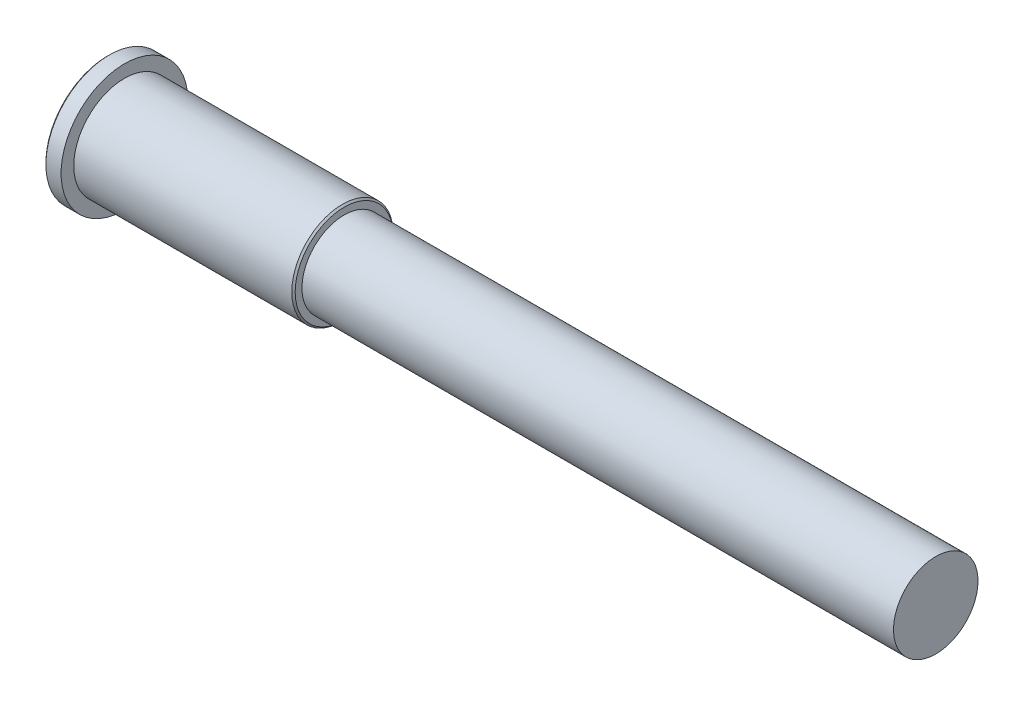
ISO-10303-21;
HEADER;
FILE_DESCRIPTION(('STEP AP214'),'2;1');
FILE_NAME('part.step','',(''),(''),'','','');
FILE_SCHEMA(('AUTOMOTIVE_DESIGN { 1 0 10303 214 1 1 1 1 }'));
ENDSEC;
DATA;
#1=APPLICATION_CONTEXT('core data for automotive mechanical design processes');
#2=APPLICATION_PROTOCOL_DEFINITION('international standard','automotive_design',2000,#1);
#3=PRODUCT_CONTEXT('',#1,'mechanical');
#4=PRODUCT('Part','Part','',(#3));
#5=PRODUCT_RELATED_PRODUCT_CATEGORY('part','',(#4));
#6=PRODUCT_DEFINITION_FORMATION('','',#4);
#7=PRODUCT_DEFINITION_CONTEXT('part definition',#1,'design');
#8=PRODUCT_DEFINITION('design','',#6,#7);
#9=PRODUCT_DEFINITION_SHAPE('','',#8);
#10=(LENGTH_UNIT() NAMED_UNIT(*) SI_UNIT(.MILLI.,.METRE.));
#11=(NAMED_UNIT(*) PLANE_ANGLE_UNIT() SI_UNIT($,.RADIAN.));
#12=(NAMED_UNIT(*) SI_UNIT($,.STERADIAN.) SOLID_ANGLE_UNIT());
#13=UNCERTAINTY_MEASURE_WITH_UNIT(LENGTH_MEASURE(1.E-05),#10,'distance_accuracy_value','');
#14=(GEOMETRIC_REPRESENTATION_CONTEXT(3) GLOBAL_UNCERTAINTY_ASSIGNED_CONTEXT((#13)) GLOBAL_UNIT_ASSIGNED_CONTEXT((#10,
#11,#12)) REPRESENTATION_CONTEXT('',''));
#15=CARTESIAN_POINT('',(0.,0.,0.));
#16=DIRECTION('',(0.,0.,1.));
#17=DIRECTION('',(1.,0.,0.));
#18=AXIS2_PLACEMENT_3D('',#15,#16,#17);
#19=CARTESIAN_POINT('',(2.,0.,0.));
#20=DIRECTION('',(-1.,0.,0.));
#21=DIRECTION('',(0.,0.,1.));
#22=AXIS2_PLACEMENT_3D('',#19,#20,#21);
#23=CYLINDRICAL_SURFACE('',#22,7.5);
#24=CARTESIAN_POINT('',(0.2,0.,0.));
#25=DIRECTION('',(1.,0.,0.));
#26=DIRECTION('',(0.,0.,-1.));
#27=AXIS2_PLACEMENT_3D('',#24,#25,#26);
#28=CIRCLE('',#27,7.5);
#29=CARTESIAN_POINT('',(0.2,0.,-7.5));
#30=VERTEX_POINT('',#29);
#31=EDGE_CURVE('E52',#30,#30,#28,.T.);
#32=ORIENTED_EDGE('',*,*,#31,.T.);
#33=EDGE_LOOP('',(#32));
#34=FACE_BOUND('',#33,.T.);
#35=CARTESIAN_POINT('',(2.,0.,0.));
#36=DIRECTION('',(1.,0.,0.));
#37=DIRECTION('',(0.,0.,-1.));
#38=AXIS2_PLACEMENT_3D('',#35,#36,#37);
#39=CIRCLE('',#38,7.5);
#40=CARTESIAN_POINT('',(2.,0.,-7.5));
#41=VERTEX_POINT('',#40);
#42=EDGE_CURVE('E69',#41,#41,#39,.T.);
#43=ORIENTED_EDGE('',*,*,#42,.F.);
#44=EDGE_LOOP('',(#43));
#45=FACE_BOUND('',#44,.T.);
#46=ADVANCED_FACE('F43',(#34,#45),#23,.T.);
#47=CARTESIAN_POINT('',(2.,0.,0.));
#48=DIRECTION('',(1.,0.,0.));
#49=DIRECTION('',(0.,0.,-1.));
#50=AXIS2_PLACEMENT_3D('',#47,#48,#49);
#51=PLANE('',#50);
#52=CARTESIAN_POINT('',(2.,0.,0.));
#53=DIRECTION('',(1.,0.,0.));
#54=DIRECTION('',(0.,0.,-1.));
#55=AXIS2_PLACEMENT_3D('',#52,#53,#54);
#56=CIRCLE('',#55,6.);
#57=CARTESIAN_POINT('',(2.,0.,6.));
#58=VERTEX_POINT('',#57);
#59=EDGE_CURVE('E73',#58,#58,#56,.T.);
#60=ORIENTED_EDGE('',*,*,#59,.F.);
#61=EDGE_LOOP('',(#60));
#62=FACE_BOUND('',#61,.T.);
#63=ORIENTED_EDGE('',*,*,#42,.T.);
#64=EDGE_LOOP('',(#63));
#65=FACE_BOUND('',#64,.T.);
#66=ADVANCED_FACE('F105',(#62,#65),#51,.T.);
#67=CARTESIAN_POINT('',(0.,0.,0.));
#68=DIRECTION('',(1.,0.,0.));
#69=DIRECTION('',(0.,0.,-1.));
#70=AXIS2_PLACEMENT_3D('',#67,#68,#69);
#71=PLANE('',#70);
#72=CARTESIAN_POINT('',(0.,0.,0.));
#73=DIRECTION('',(1.,0.,0.));
#74=DIRECTION('',(0.,0.,-1.));
#75=AXIS2_PLACEMENT_3D('',#72,#73,#74);
#76=CIRCLE('',#75,7.3);
#77=CARTESIAN_POINT('',(0.,0.,-7.3));
#78=VERTEX_POINT('',#77);
#79=EDGE_CURVE('E10',#78,#78,#76,.F.);
#80=ORIENTED_EDGE('',*,*,#79,.T.);
#81=EDGE_LOOP('',(#80));
#82=FACE_BOUND('',#81,.T.);
#83=ADVANCED_FACE('F101',(#82),#71,.F.);
#84=CARTESIAN_POINT('',(28.,0.,0.));
#85=DIRECTION('',(-1.,0.,0.));
#86=DIRECTION('',(0.,0.,1.));
#87=AXIS2_PLACEMENT_3D('',#84,#85,#86);
#88=CYLINDRICAL_SURFACE('',#87,6.);
#89=CARTESIAN_POINT('',(27.8000000000001,0.,0.));
#90=DIRECTION('',(1.,0.,0.));
#91=DIRECTION('',(0.,0.,-1.));
#92=AXIS2_PLACEMENT_3D('',#89,#90,#91);
#93=CIRCLE('',#92,6.);
#94=CARTESIAN_POINT('',(27.8000000000001,0.,6.));
#95=VERTEX_POINT('',#94);
#96=EDGE_CURVE('E57',#95,#95,#93,.F.);
#97=CARTESIAN_POINT('',(27.8000000000001,0.,6.));
#98=CARTESIAN_POINT('',(27.5312500000001,0.,6.));
#99=CARTESIAN_POINT('',(27.2625000000001,0.,6.));
#100=CARTESIAN_POINT('',(26.7250000000001,0.,6.));
#101=CARTESIAN_POINT('',(26.4562500000001,0.,6.));
#102=CARTESIAN_POINT('',(25.9187500000001,0.,6.));
#103=CARTESIAN_POINT('',(25.6500000000001,0.,6.));
#104=CARTESIAN_POINT('',(25.1125000000001,0.,6.));
#105=CARTESIAN_POINT('',(24.8437500000001,0.,6.));
#106=CARTESIAN_POINT('',(24.3062500000001,0.,6.));
#107=CARTESIAN_POINT('',(24.0375000000001,0.,6.));
#108=CARTESIAN_POINT('',(23.5000000000001,0.,6.));
#109=CARTESIAN_POINT('',(23.2312500000001,0.,6.));
#110=CARTESIAN_POINT('',(22.6937500000001,0.,6.));
#111=CARTESIAN_POINT('',(22.4250000000001,0.,6.));
#112=CARTESIAN_POINT('',(21.8875000000001,0.,6.));
#113=CARTESIAN_POINT('',(21.6187500000001,0.,6.));
#114=CARTESIAN_POINT('',(21.0812500000001,0.,6.));
#115=CARTESIAN_POINT('',(20.8125000000001,0.,6.));
#116=CARTESIAN_POINT('',(20.275,0.,6.));
#117=CARTESIAN_POINT('',(20.0062500000001,0.,6.));
#118=CARTESIAN_POINT('',(19.46875,0.,6.));
#119=CARTESIAN_POINT('',(19.2,0.,6.));
#120=CARTESIAN_POINT('',(18.6625,0.,6.));
#121=CARTESIAN_POINT('',(18.39375,0.,6.));
#122=CARTESIAN_POINT('',(17.85625,0.,6.));
#123=CARTESIAN_POINT('',(17.5875,0.,6.));
#124=CARTESIAN_POINT('',(17.05,0.,6.));
#125=CARTESIAN_POINT('',(16.78125,0.,6.));
#126=CARTESIAN_POINT('',(16.24375,0.,6.));
#127=CARTESIAN_POINT('',(15.975,0.,6.));
#128=CARTESIAN_POINT('',(15.4375,0.,6.));
#129=CARTESIAN_POINT('',(15.16875,0.,6.));
#130=CARTESIAN_POINT('',(14.63125,0.,6.));
#131=CARTESIAN_POINT('',(14.3625,0.,6.));
#132=CARTESIAN_POINT('',(13.825,0.,6.));
#133=CARTESIAN_POINT('',(13.55625,0.,6.));
#134=CARTESIAN_POINT('',(13.01875,0.,6.));
#135=CARTESIAN_POINT('',(12.75,0.,6.));
#136=CARTESIAN_POINT('',(12.2125,0.,6.));
#137=CARTESIAN_POINT('',(11.94375,0.,6.));
#138=CARTESIAN_POINT('',(11.40625,0.,6.));
#139=CARTESIAN_POINT('',(11.1375,0.,6.));
#140=CARTESIAN_POINT('',(10.6,0.,6.));
#141=CARTESIAN_POINT('',(10.33125,0.,6.));
#142=CARTESIAN_POINT('',(9.79375000000002,0.,6.));
#143=CARTESIAN_POINT('',(9.52500000000002,0.,6.));
#144=CARTESIAN_POINT('',(8.98750000000002,0.,6.));
#145=CARTESIAN_POINT('',(8.71875000000002,0.,6.));
#146=CARTESIAN_POINT('',(8.18125000000002,0.,6.));
#147=CARTESIAN_POINT('',(7.91250000000001,0.,6.));
#148=CARTESIAN_POINT('',(7.37500000000001,0.,6.));
#149=CARTESIAN_POINT('',(7.10625000000001,0.,6.));
#150=CARTESIAN_POINT('',(6.56875000000001,0.,6.));
#151=CARTESIAN_POINT('',(6.30000000000001,0.,6.));
#152=CARTESIAN_POINT('',(5.76250000000001,0.,6.));
#153=CARTESIAN_POINT('',(5.49375000000001,0.,6.));
#154=CARTESIAN_POINT('',(4.95625000000001,0.,6.));
#155=CARTESIAN_POINT('',(4.68750000000001,0.,6.));
#156=CARTESIAN_POINT('',(4.15000000000001,0.,6.));
#157=CARTESIAN_POINT('',(3.88125,0.,6.));
#158=CARTESIAN_POINT('',(3.34375,0.,6.));
#159=CARTESIAN_POINT('',(3.075,0.,6.));
#160=CARTESIAN_POINT('',(2.5375,0.,6.));
#161=CARTESIAN_POINT('',(2.26875,0.,6.));
#162=CARTESIAN_POINT('',(2.,0.,6.));
#163=B_SPLINE_CURVE_WITH_KNOTS('',3,(#97,#98,#99,#100,#101,#102,#103,#104,#105,#106,#107,#108,
#109,#110,#111,#112,#113,#114,#115,#116,#117,#118,#119,#120,#121,#122,#123,#124,#125,#126,#127,
#128,#129,#130,#131,#132,#133,#134,#135,#136,#137,#138,#139,#140,#141,#142,#143,#144,#145,#146,
#147,#148,#149,#150,#151,#152,#153,#154,#155,#156,#157,#158,#159,#160,#161,#162),.UNSPECIFIED.,
.F.,.F.,(4,2,2,2,2,2,2,2,2,2,2,2,2,2,2,2,2,2,2,2,2,2,2,2,2,2,2,2,2,2,2,2,4),(0.,
0.806250000000001,1.6125,2.41875,3.22500000000001,4.03125000000001,4.83750000000001,
5.64375000000001,6.45000000000001,7.25625000000002,8.06250000000002,8.86875000000002,
9.67500000000003,10.48125,11.2875,12.09375,12.9,13.70625,14.5125,15.31875,16.125,16.93125,
17.7375,18.54375,19.3500000000001,20.1562500000001,20.9625000000001,21.7687500000001,
22.5750000000001,23.3812500000001,24.1875000000001,24.9937500000001,25.8000000000001),.UNSPECIFIED.);
#164=EDGE_CURVE('BSEAM95',#95,#58,#163,.T.);
#165=ORIENTED_EDGE('',*,*,#96,.T.);
#166=ORIENTED_EDGE('',*,*,#59,.T.);
#167=ORIENTED_EDGE('',*,*,#164,.T.);
#168=ORIENTED_EDGE('',*,*,#164,.F.);
#169=EDGE_LOOP('',(#165,#167,#166,#168));
#170=FACE_BOUND('',#169,.T.);
#171=ADVANCED_FACE('F95',(#170),#88,.T.);
#172=CARTESIAN_POINT('',(28.,0.,0.));
#173=DIRECTION('',(1.,0.,0.));
#174=DIRECTION('',(0.,0.,-1.));
#175=AXIS2_PLACEMENT_3D('',#172,#173,#174);
#176=PLANE('',#175);
#177=CARTESIAN_POINT('',(28.,0.,0.));
#178=DIRECTION('',(1.,0.,0.));
#179=DIRECTION('',(0.,0.,-1.));
#180=AXIS2_PLACEMENT_3D('',#177,#178,#179);
#181=CIRCLE('',#180,5.80000000000007);
#182=CARTESIAN_POINT('',(28.,0.,5.80000000000007));
#183=VERTEX_POINT('',#182);
#184=EDGE_CURVE('E62',#183,#183,#181,.T.);
#185=ORIENTED_EDGE('',*,*,#184,.T.);
#186=EDGE_LOOP('',(#185));
#187=FACE_BOUND('',#186,.T.);
#188=CARTESIAN_POINT('',(28.,0.,0.));
#189=DIRECTION('',(1.,0.,0.));
#190=DIRECTION('',(0.,0.,-1.));
#191=AXIS2_PLACEMENT_3D('',#188,#189,#190);
#192=CIRCLE('',#191,5.);
#193=CARTESIAN_POINT('',(28.,0.,-5.));
#194=VERTEX_POINT('',#193);
#195=EDGE_CURVE('E68',#194,#194,#192,.T.);
#196=ORIENTED_EDGE('',*,*,#195,.F.);
#197=EDGE_LOOP('',(#196));
#198=FACE_BOUND('',#197,.T.);
#199=ADVANCED_FACE('F90',(#187,#198),#176,.T.);
#200=CARTESIAN_POINT('',(98.,0.,0.));
#201=DIRECTION('',(-1.,0.,0.));
#202=DIRECTION('',(0.,0.,1.));
#203=AXIS2_PLACEMENT_3D('',#200,#201,#202);
#204=CYLINDRICAL_SURFACE('',#203,5.);
#205=CARTESIAN_POINT('',(98.,0.,0.));
#206=DIRECTION('',(1.,0.,0.));
#207=DIRECTION('',(0.,0.,-1.));
#208=AXIS2_PLACEMENT_3D('',#205,#206,#207);
#209=CIRCLE('',#208,5.);
#210=CARTESIAN_POINT('',(98.,0.,-5.));
#211=VERTEX_POINT('',#210);
#212=EDGE_CURVE('E74',#211,#211,#209,.T.);
#213=ORIENTED_EDGE('',*,*,#212,.F.);
#214=EDGE_LOOP('',(#213));
#215=FACE_BOUND('',#214,.T.);
#216=ORIENTED_EDGE('',*,*,#195,.T.);
#217=EDGE_LOOP('',(#216));
#218=FACE_BOUND('',#217,.T.);
#219=ADVANCED_FACE('F87',(#215,#218),#204,.T.);
#220=CARTESIAN_POINT('',(98.,0.,0.));
#221=DIRECTION('',(1.,0.,0.));
#222=DIRECTION('',(0.,0.,-1.));
#223=AXIS2_PLACEMENT_3D('',#220,#221,#222);
#224=PLANE('',#223);
#225=ORIENTED_EDGE('',*,*,#212,.T.);
#226=EDGE_LOOP('',(#225));
#227=FACE_BOUND('',#226,.T.);
#228=ADVANCED_FACE('F85',(#227),#224,.T.);
#229=CARTESIAN_POINT('',(28.,0.,0.));
#230=DIRECTION('',(-1.,0.,0.));
#231=DIRECTION('',(0.,0.,1.));
#232=AXIS2_PLACEMENT_3D('',#229,#230,#231);
#233=CONICAL_SURFACE('',#232,5.80000000000007,0.785398163397474);
#234=CARTESIAN_POINT('',(27.8000000000001,0.,6.));
#235=CARTESIAN_POINT('',(27.8020833333334,0.,5.99791666666667));
#236=CARTESIAN_POINT('',(27.8041666666667,0.,5.99583333333334));
#237=CARTESIAN_POINT('',(27.8083333333334,0.,5.99166666666667));
#238=CARTESIAN_POINT('',(27.8104166666667,0.,5.98958333333334));
#239=CARTESIAN_POINT('',(27.8145833333334,0.,5.98541666666667));
#240=CARTESIAN_POINT('',(27.8166666666667,0.,5.98333333333334));
#241=CARTESIAN_POINT('',(27.8208333333334,0.,5.97916666666668));
#242=CARTESIAN_POINT('',(27.8229166666667,0.,5.97708333333334));
#243=CARTESIAN_POINT('',(27.8270833333334,0.,5.97291666666668));
#244=CARTESIAN_POINT('',(27.8291666666667,0.,5.97083333333335));
#245=CARTESIAN_POINT('',(27.8333333333334,0.,5.96666666666668));
#246=CARTESIAN_POINT('',(27.8354166666667,0.,5.96458333333335));
#247=CARTESIAN_POINT('',(27.8395833333334,0.,5.96041666666668));
#248=CARTESIAN_POINT('',(27.8416666666667,0.,5.95833333333335));
#249=CARTESIAN_POINT('',(27.8458333333334,0.,5.95416666666669));
#250=CARTESIAN_POINT('',(27.8479166666667,0.,5.95208333333335));
#251=CARTESIAN_POINT('',(27.8520833333334,0.,5.94791666666669));
#252=CARTESIAN_POINT('',(27.8541666666667,0.,5.94583333333336));
#253=CARTESIAN_POINT('',(27.8583333333334,0.,5.94166666666669));
#254=CARTESIAN_POINT('',(27.8604166666667,0.,5.93958333333336));
#255=CARTESIAN_POINT('',(27.8645833333334,0.,5.93541666666669));
#256=CARTESIAN_POINT('',(27.8666666666667,0.,5.93333333333336));
#257=CARTESIAN_POINT('',(27.8708333333334,0.,5.92916666666669));
#258=CARTESIAN_POINT('',(27.8729166666667,0.,5.92708333333336));
#259=CARTESIAN_POINT('',(27.8770833333334,0.,5.9229166666667));
#260=CARTESIAN_POINT('',(27.8791666666667,0.,5.92083333333336));
#261=CARTESIAN_POINT('',(27.8833333333334,0.,5.9166666666667));
#262=CARTESIAN_POINT('',(27.8854166666667,0.,5.91458333333336));
#263=CARTESIAN_POINT('',(27.8895833333334,0.,5.9104166666667));
#264=CARTESIAN_POINT('',(27.8916666666667,0.,5.90833333333337));
#265=CARTESIAN_POINT('',(27.8958333333334,0.,5.9041666666667));
#266=CARTESIAN_POINT('',(27.8979166666667,0.,5.90208333333337));
#267=CARTESIAN_POINT('',(27.9020833333334,0.,5.8979166666667));
#268=CARTESIAN_POINT('',(27.9041666666667,0.,5.89583333333337));
#269=CARTESIAN_POINT('',(27.9083333333334,0.,5.89166666666671));
#270=CARTESIAN_POINT('',(27.9104166666667,0.,5.88958333333337));
#271=CARTESIAN_POINT('',(27.9145833333334,0.,5.88541666666671));
#272=CARTESIAN_POINT('',(27.9166666666667,0.,5.88333333333338));
#273=CARTESIAN_POINT('',(27.9208333333334,0.,5.87916666666671));
#274=CARTESIAN_POINT('',(27.9229166666667,0.,5.87708333333338));
#275=CARTESIAN_POINT('',(27.9270833333334,0.,5.87291666666671));
#276=CARTESIAN_POINT('',(27.9291666666667,0.,5.87083333333338));
#277=CARTESIAN_POINT('',(27.9333333333334,0.,5.86666666666671));
#278=CARTESIAN_POINT('',(27.9354166666667,0.,5.86458333333338));
#279=CARTESIAN_POINT('',(27.9395833333334,0.,5.86041666666672));
#280=CARTESIAN_POINT('',(27.9416666666667,0.,5.85833333333338));
#281=CARTESIAN_POINT('',(27.9458333333334,0.,5.85416666666672));
#282=CARTESIAN_POINT('',(27.9479166666667,0.,5.85208333333339));
#283=CARTESIAN_POINT('',(27.9520833333333,0.,5.84791666666672));
#284=CARTESIAN_POINT('',(27.9541666666667,0.,5.84583333333339));
#285=CARTESIAN_POINT('',(27.9583333333333,0.,5.84166666666672));
#286=CARTESIAN_POINT('',(27.9604166666667,0.,5.83958333333339));
#287=CARTESIAN_POINT('',(27.9645833333333,0.,5.83541666666672));
#288=CARTESIAN_POINT('',(27.9666666666667,0.,5.83333333333339));
#289=CARTESIAN_POINT('',(27.9708333333333,0.,5.82916666666673));
#290=CARTESIAN_POINT('',(27.9729166666667,0.,5.82708333333339));
#291=CARTESIAN_POINT('',(27.9770833333333,0.,5.82291666666673));
#292=CARTESIAN_POINT('',(27.9791666666667,0.,5.8208333333334));
#293=CARTESIAN_POINT('',(27.9833333333333,0.,5.81666666666673));
#294=CARTESIAN_POINT('',(27.9854166666667,0.,5.8145833333334));
#295=CARTESIAN_POINT('',(27.9895833333333,0.,5.81041666666673));
#296=CARTESIAN_POINT('',(27.9916666666667,0.,5.8083333333334));
#297=CARTESIAN_POINT('',(27.9958333333333,0.,5.80416666666673));
#298=CARTESIAN_POINT('',(27.9979166666667,0.,5.8020833333334));
#299=CARTESIAN_POINT('',(28.,0.,5.80000000000007));
#300=B_SPLINE_CURVE_WITH_KNOTS('',3,(#234,#235,#236,#237,#238,#239,#240,#241,#242,#243,#244,
#245,#246,#247,#248,#249,#250,#251,#252,#253,#254,#255,#256,#257,#258,#259,#260,#261,#262,#263,
#264,#265,#266,#267,#268,#269,#270,#271,#272,#273,#274,#275,#276,#277,#278,#279,#280,#281,#282,
#283,#284,#285,#286,#287,#288,#289,#290,#291,#292,#293,#294,#295,#296,#297,#298,#299),
.UNSPECIFIED.,.F.,.F.,(4,2,2,2,2,2,2,2,2,2,2,2,2,2,2,2,2,2,2,2,2,2,2,2,2,2,2,2,2,2,2,2,4),(0.,
0.00883883476482964,0.0176776695296574,0.0265165042944871,0.0353553390593143,0.0441941738241445,
0.0530330085889717,0.061871843353802,0.0707106781186292,0.0795495128834588,0.0883883476482866,
0.0972271824131163,0.106066017177946,0.114904851942774,0.123743686707601,0.132582521472431,
0.141421356237258,0.150260191002088,0.159099025766916,0.167937860531745,0.176776695296573,
0.185615530061403,0.19445436482623,0.20329319959106,0.21213203435589,0.220970869120717,
0.229809703885547,0.238648538650375,0.247487373415205,0.256326208180032,0.265165042944862,
0.274003877709689,0.282842712474519),.UNSPECIFIED.);
#301=EDGE_CURVE('BSEAM115',#95,#183,#300,.T.);
#302=ORIENTED_EDGE('',*,*,#96,.F.);
#303=ORIENTED_EDGE('',*,*,#184,.F.);
#304=ORIENTED_EDGE('',*,*,#301,.T.);
#305=ORIENTED_EDGE('',*,*,#301,.F.);
#306=EDGE_LOOP('',(#302,#304,#303,#305));
#307=FACE_BOUND('',#306,.T.);
#308=ADVANCED_FACE('F115',(#307),#233,.T.);
#309=CARTESIAN_POINT('',(0.2,0.,0.));
#310=DIRECTION('',(1.,0.,0.));
#311=DIRECTION('',(0.,0.,-1.));
#312=AXIS2_PLACEMENT_3D('',#309,#310,#311);
#313=CONICAL_SURFACE('',#312,7.5,0.785398163397444);
#314=CARTESIAN_POINT('',(0.,0.,-7.3));
#315=CARTESIAN_POINT('',(0.00208333333333309,0.,-7.30208333333334));
#316=CARTESIAN_POINT('',(0.00416666666666649,0.,-7.30416666666667));
#317=CARTESIAN_POINT('',(0.00833333333333329,0.,-7.30833333333334));
#318=CARTESIAN_POINT('',(0.0104166666666667,0.,-7.31041666666667));
#319=CARTESIAN_POINT('',(0.0145833333333334,0.,-7.31458333333333));
#320=CARTESIAN_POINT('',(0.0166666666666666,0.,-7.31666666666667));
#321=CARTESIAN_POINT('',(0.0208333333333333,0.,-7.32083333333333));
#322=CARTESIAN_POINT('',(0.0229166666666666,0.,-7.32291666666667));
#323=CARTESIAN_POINT('',(0.0270833333333332,0.,-7.32708333333334));
#324=CARTESIAN_POINT('',(0.0291666666666665,0.,-7.32916666666667));
#325=CARTESIAN_POINT('',(0.0333333333333332,0.,-7.33333333333333));
#326=CARTESIAN_POINT('',(0.0354166666666666,0.,-7.33541666666667));
#327=CARTESIAN_POINT('',(0.0395833333333333,0.,-7.33958333333333));
#328=CARTESIAN_POINT('',(0.0416666666666666,0.,-7.34166666666667));
#329=CARTESIAN_POINT('',(0.0458333333333332,0.,-7.34583333333333));
#330=CARTESIAN_POINT('',(0.0479166666666665,0.,-7.34791666666667));
#331=CARTESIAN_POINT('',(0.0520833333333332,0.,-7.35208333333333));
#332=CARTESIAN_POINT('',(0.0541666666666666,0.,-7.35416666666667));
#333=CARTESIAN_POINT('',(0.0583333333333333,0.,-7.35833333333333));
#334=CARTESIAN_POINT('',(0.0604166666666665,0.,-7.36041666666667));
#335=CARTESIAN_POINT('',(0.0645833333333332,0.,-7.36458333333333));
#336=CARTESIAN_POINT('',(0.0666666666666666,0.,-7.36666666666667));
#337=CARTESIAN_POINT('',(0.0708333333333332,0.,-7.37083333333333));
#338=CARTESIAN_POINT('',(0.0729166666666664,0.,-7.37291666666667));
#339=CARTESIAN_POINT('',(0.0770833333333331,0.,-7.37708333333333));
#340=CARTESIAN_POINT('',(0.0791666666666666,0.,-7.37916666666667));
#341=CARTESIAN_POINT('',(0.0833333333333333,0.,-7.38333333333333));
#342=CARTESIAN_POINT('',(0.0854166666666665,0.,-7.38541666666667));
#343=CARTESIAN_POINT('',(0.0895833333333331,0.,-7.38958333333333));
#344=CARTESIAN_POINT('',(0.0916666666666664,0.,-7.39166666666667));
#345=CARTESIAN_POINT('',(0.0958333333333331,0.,-7.39583333333333));
#346=CARTESIAN_POINT('',(0.0979166666666665,0.,-7.39791666666667));
#347=CARTESIAN_POINT('',(0.102083333333333,0.,-7.40208333333333));
#348=CARTESIAN_POINT('',(0.104166666666666,0.,-7.40416666666667));
#349=CARTESIAN_POINT('',(0.108333333333333,0.,-7.40833333333333));
#350=CARTESIAN_POINT('',(0.110416666666666,0.,-7.41041666666667));
#351=CARTESIAN_POINT('',(0.114583333333333,0.,-7.41458333333333));
#352=CARTESIAN_POINT('',(0.116666666666666,0.,-7.41666666666667));
#353=CARTESIAN_POINT('',(0.120833333333333,0.,-7.42083333333333));
#354=CARTESIAN_POINT('',(0.122916666666667,0.,-7.42291666666667));
#355=CARTESIAN_POINT('',(0.127083333333333,0.,-7.42708333333333));
#356=CARTESIAN_POINT('',(0.129166666666666,0.,-7.42916666666667));
#357=CARTESIAN_POINT('',(0.133333333333333,0.,-7.43333333333333));
#358=CARTESIAN_POINT('',(0.135416666666666,0.,-7.43541666666667));
#359=CARTESIAN_POINT('',(0.139583333333333,0.,-7.43958333333333));
#360=CARTESIAN_POINT('',(0.141666666666666,0.,-7.44166666666667));
#361=CARTESIAN_POINT('',(0.145833333333333,0.,-7.44583333333333));
#362=CARTESIAN_POINT('',(0.147916666666666,0.,-7.44791666666667));
#363=CARTESIAN_POINT('',(0.152083333333333,0.,-7.45208333333333));
#364=CARTESIAN_POINT('',(0.154166666666666,0.,-7.45416666666667));
#365=CARTESIAN_POINT('',(0.158333333333333,0.,-7.45833333333333));
#366=CARTESIAN_POINT('',(0.160416666666666,0.,-7.46041666666667));
#367=CARTESIAN_POINT('',(0.164583333333333,0.,-7.46458333333333));
#368=CARTESIAN_POINT('',(0.166666666666666,0.,-7.46666666666667));
#369=CARTESIAN_POINT('',(0.170833333333333,0.,-7.47083333333333));
#370=CARTESIAN_POINT('',(0.172916666666666,0.,-7.47291666666667));
#371=CARTESIAN_POINT('',(0.177083333333333,0.,-7.47708333333333));
#372=CARTESIAN_POINT('',(0.179166666666666,0.,-7.47916666666667));
#373=CARTESIAN_POINT('',(0.183333333333333,0.,-7.48333333333333));
#374=CARTESIAN_POINT('',(0.185416666666666,0.,-7.48541666666667));
#375=CARTESIAN_POINT('',(0.189583333333333,0.,-7.48958333333333));
#376=CARTESIAN_POINT('',(0.191666666666666,0.,-7.49166666666667));
#377=CARTESIAN_POINT('',(0.195833333333333,0.,-7.49583333333333));
#378=CARTESIAN_POINT('',(0.197916666666667,0.,-7.49791666666667));
#379=CARTESIAN_POINT('',(0.2,0.,-7.5));
#380=B_SPLINE_CURVE_WITH_KNOTS('',3,(#314,#315,#316,#317,#318,#319,#320,#321,#322,#323,#324,
#325,#326,#327,#328,#329,#330,#331,#332,#333,#334,#335,#336,#337,#338,#339,#340,#341,#342,#343,
#344,#345,#346,#347,#348,#349,#350,#351,#352,#353,#354,#355,#356,#357,#358,#359,#360,#361,#362,
#363,#364,#365,#366,#367,#368,#369,#370,#371,#372,#373,#374,#375,#376,#377,#378,#379),
.UNSPECIFIED.,.F.,.F.,(4,2,2,2,2,2,2,2,2,2,2,2,2,2,2,2,2,2,2,2,2,2,2,2,2,2,2,2,2,2,2,2,4),(0.,
0.00883883476483196,0.0176776695296633,0.0265165042944953,0.0353553390593272,0.0441941738241592,
0.0530330085889906,0.0618718433538225,0.0707106781186545,0.0795495128834858,0.0883883476483178,
0.0972271824131498,0.106066017177982,0.114904851942813,0.123743686707645,0.132582521472477,
0.141421356237308,0.15026019100214,0.159099025766972,0.167937860531804,0.176776695296636,
0.185615530061468,0.1944543648263,0.203293199591131,0.212132034355963,0.220970869120795,
0.229809703885627,0.238648538650458,0.24748737341529,0.256326208180122,0.265165042944954,
0.274003877709785,0.282842712474617),.UNSPECIFIED.);
#381=EDGE_CURVE('BSEAM46',#78,#30,#380,.T.);
#382=ORIENTED_EDGE('',*,*,#79,.F.);
#383=ORIENTED_EDGE('',*,*,#31,.F.);
#384=ORIENTED_EDGE('',*,*,#381,.T.);
#385=ORIENTED_EDGE('',*,*,#381,.F.);
#386=EDGE_LOOP('',(#382,#384,#383,#385));
#387=FACE_BOUND('',#386,.T.);
#388=ADVANCED_FACE('F46',(#387),#313,.T.);
#389=CLOSED_SHELL('',(#46,#66,#83,#171,#199,#219,#228,#308,#388));
#390=MANIFOLD_SOLID_BREP('B2',#389);
#391=ADVANCED_BREP_SHAPE_REPRESENTATION('',(#18,#390),#14);
#392=SHAPE_DEFINITION_REPRESENTATION(#9,#391);
ENDSEC;
END-ISO-10303-21;
